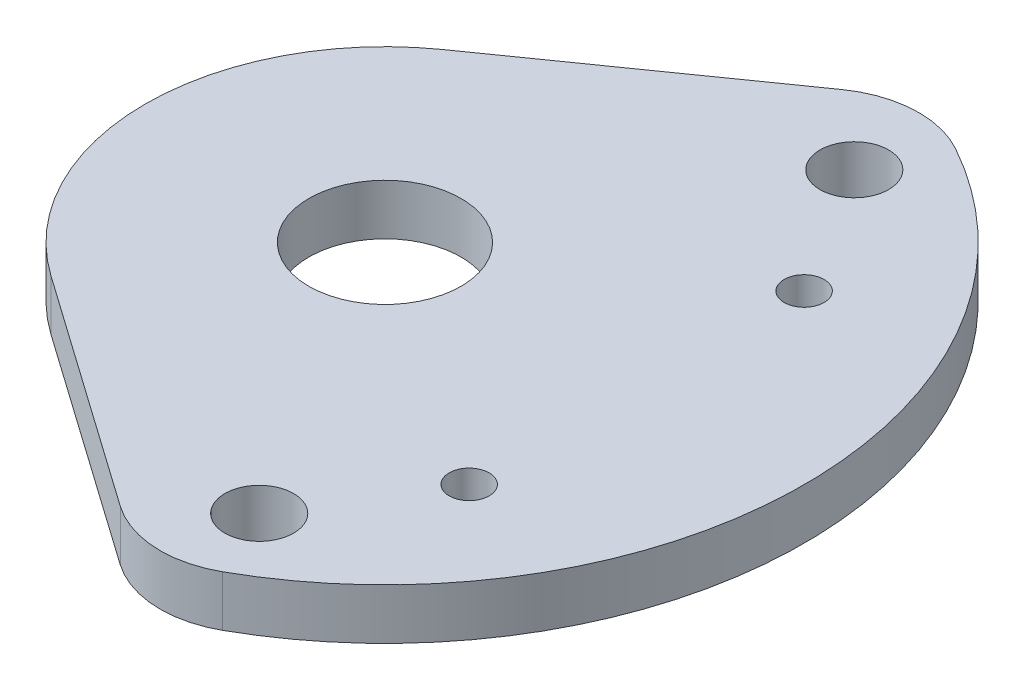
ISO-10303-21;
HEADER;
FILE_DESCRIPTION(('STEP AP214'),'2;1');
FILE_NAME('part.step','',(''),(''),'','','');
FILE_SCHEMA(('AUTOMOTIVE_DESIGN { 1 0 10303 214 1 1 1 1 }'));
ENDSEC;
DATA;
#1=APPLICATION_CONTEXT('core data for automotive mechanical design processes');
#2=APPLICATION_PROTOCOL_DEFINITION('international standard','automotive_design',2000,#1);
#3=PRODUCT_CONTEXT('',#1,'mechanical');
#4=PRODUCT('Part','Part','',(#3));
#5=PRODUCT_RELATED_PRODUCT_CATEGORY('part','',(#4));
#6=PRODUCT_DEFINITION_FORMATION('','',#4);
#7=PRODUCT_DEFINITION_CONTEXT('part definition',#1,'design');
#8=PRODUCT_DEFINITION('design','',#6,#7);
#9=PRODUCT_DEFINITION_SHAPE('','',#8);
#10=(LENGTH_UNIT() NAMED_UNIT(*) SI_UNIT(.MILLI.,.METRE.));
#11=(NAMED_UNIT(*) PLANE_ANGLE_UNIT() SI_UNIT($,.RADIAN.));
#12=(NAMED_UNIT(*) SI_UNIT($,.STERADIAN.) SOLID_ANGLE_UNIT());
#13=UNCERTAINTY_MEASURE_WITH_UNIT(LENGTH_MEASURE(1.E-05),#10,'distance_accuracy_value','');
#14=(GEOMETRIC_REPRESENTATION_CONTEXT(3) GLOBAL_UNCERTAINTY_ASSIGNED_CONTEXT((#13)) GLOBAL_UNIT_ASSIGNED_CONTEXT((#10,
#11,#12)) REPRESENTATION_CONTEXT('',''));
#15=CARTESIAN_POINT('',(0.,0.,0.));
#16=DIRECTION('',(0.,0.,1.));
#17=DIRECTION('',(1.,0.,0.));
#18=AXIS2_PLACEMENT_3D('',#15,#16,#17);
#19=CARTESIAN_POINT('',(-8.63580547562455,1.5875,-12.2646999061197));
#20=DIRECTION('',(0.575720365041637,0.,0.817646660407981));
#21=DIRECTION('',(0.817646660407981,0.,-0.575720365041637));
#22=AXIS2_PLACEMENT_3D('',#19,#20,#21);
#23=PLANE('',#22);
#24=DIRECTION('',(-0.817646660407981,0.,0.575720365041637));
#25=VECTOR('',#24,1.);
#26=CARTESIAN_POINT('',(-8.63580547562455,1.5875,-12.2646999061197));
#27=LINE('',#26,#25);
#28=CARTESIAN_POINT('',(6.01781653588474,1.5875,-22.5825902885482));
#29=VERTEX_POINT('',#28);
#30=CARTESIAN_POINT('',(-8.63580547562455,1.5875,-12.2646999061197));
#31=VERTEX_POINT('',#30);
#32=EDGE_CURVE('E93',#29,#31,#27,.T.);
#33=ORIENTED_EDGE('',*,*,#32,.F.);
#34=DIRECTION('',(0.,-1.,0.));
#35=VECTOR('',#34,1.);
#36=CARTESIAN_POINT('',(6.01781653588474,1.5875,-22.5825902885482));
#37=LINE('',#36,#35);
#38=CARTESIAN_POINT('',(6.01781653588474,-1.5875,-22.5825902885482));
#39=VERTEX_POINT('',#38);
#40=EDGE_CURVE('E118',#29,#39,#37,.T.);
#41=ORIENTED_EDGE('',*,*,#40,.T.);
#42=DIRECTION('',(-0.817646660407981,0.,0.575720365041637));
#43=VECTOR('',#42,1.);
#44=CARTESIAN_POINT('',(-8.63580547562455,-1.5875,-12.2646999061197));
#45=LINE('',#44,#43);
#46=CARTESIAN_POINT('',(-8.63580547562455,-1.5875,-12.2646999061197));
#47=VERTEX_POINT('',#46);
#48=EDGE_CURVE('E116',#39,#47,#45,.T.);
#49=ORIENTED_EDGE('',*,*,#48,.T.);
#50=DIRECTION('',(0.,-1.,0.));
#51=VECTOR('',#50,1.);
#52=CARTESIAN_POINT('',(-8.63580547562455,1.5875,-12.2646999061197));
#53=LINE('',#52,#51);
#54=EDGE_CURVE('E110',#31,#47,#53,.T.);
#55=ORIENTED_EDGE('',*,*,#54,.F.);
#56=EDGE_LOOP('',(#33,#41,#49,#55));
#57=FACE_BOUND('',#56,.T.);
#58=ADVANCED_FACE('F39',(#57),#23,.F.);
#59=CARTESIAN_POINT('',(0.,1.5875,0.));
#60=DIRECTION('',(0.,-1.,0.));
#61=DIRECTION('',(0.,0.,-1.));
#62=AXIS2_PLACEMENT_3D('',#59,#60,#61);
#63=CYLINDRICAL_SURFACE('',#62,15.);
#64=CARTESIAN_POINT('',(0.,-1.5875,0.));
#65=DIRECTION('',(0.,1.,0.));
#66=DIRECTION('',(0.,0.,1.));
#67=AXIS2_PLACEMENT_3D('',#64,#65,#66);
#68=CIRCLE('',#67,15.);
#69=CARTESIAN_POINT('',(-8.63580547562454,-1.5875,12.2646999061197));
#70=VERTEX_POINT('',#69);
#71=EDGE_CURVE('E147',#47,#70,#68,.T.);
#72=ORIENTED_EDGE('',*,*,#71,.T.);
#73=DIRECTION('',(0.,-1.,0.));
#74=VECTOR('',#73,1.);
#75=CARTESIAN_POINT('',(-8.63580547562454,1.5875,12.2646999061197));
#76=LINE('',#75,#74);
#77=CARTESIAN_POINT('',(-8.63580547562454,1.5875,12.2646999061197));
#78=VERTEX_POINT('',#77);
#79=EDGE_CURVE('E112',#78,#70,#76,.T.);
#80=ORIENTED_EDGE('',*,*,#79,.F.);
#81=CARTESIAN_POINT('',(0.,1.5875,0.));
#82=DIRECTION('',(0.,1.,0.));
#83=DIRECTION('',(0.,0.,1.));
#84=AXIS2_PLACEMENT_3D('',#81,#82,#83);
#85=CIRCLE('',#84,15.);
#86=EDGE_CURVE('E97',#31,#78,#85,.T.);
#87=ORIENTED_EDGE('',*,*,#86,.F.);
#88=ORIENTED_EDGE('',*,*,#54,.T.);
#89=EDGE_LOOP('',(#72,#80,#87,#88));
#90=FACE_BOUND('',#89,.T.);
#91=ADVANCED_FACE('F109',(#90),#63,.T.);
#92=CARTESIAN_POINT('',(-8.63580547562455,1.5875,12.2646999061197));
#93=DIRECTION('',(-0.575720365041636,0.,0.817646660407982));
#94=DIRECTION('',(0.817646660407982,0.,0.575720365041636));
#95=AXIS2_PLACEMENT_3D('',#92,#93,#94);
#96=PLANE('',#95);
#97=DIRECTION('',(-0.817646660407982,0.,-0.575720365041636));
#98=VECTOR('',#97,1.);
#99=CARTESIAN_POINT('',(-8.63580547562455,-1.5875,12.2646999061197));
#100=LINE('',#99,#98);
#101=CARTESIAN_POINT('',(6.01781653588475,-1.5875,22.5825902885482));
#102=VERTEX_POINT('',#101);
#103=EDGE_CURVE('E144',#102,#70,#100,.T.);
#104=ORIENTED_EDGE('',*,*,#103,.F.);
#105=DIRECTION('',(0.,1.,0.));
#106=VECTOR('',#105,1.);
#107=CARTESIAN_POINT('',(6.01781653588475,1.5875,22.5825902885482));
#108=LINE('',#107,#106);
#109=CARTESIAN_POINT('',(6.01781653588475,1.5875,22.5825902885482));
#110=VERTEX_POINT('',#109);
#111=EDGE_CURVE('E11',#102,#110,#108,.T.);
#112=ORIENTED_EDGE('',*,*,#111,.T.);
#113=DIRECTION('',(-0.817646660407982,0.,-0.575720365041636));
#114=VECTOR('',#113,1.);
#115=CARTESIAN_POINT('',(-8.63580547562455,1.5875,12.2646999061197));
#116=LINE('',#115,#114);
#117=EDGE_CURVE('E113',#110,#78,#116,.T.);
#118=ORIENTED_EDGE('',*,*,#117,.T.);
#119=ORIENTED_EDGE('',*,*,#79,.T.);
#120=EDGE_LOOP('',(#104,#112,#118,#119));
#121=FACE_BOUND('',#120,.T.);
#122=ADVANCED_FACE('F146',(#121),#96,.T.);
#123=CARTESIAN_POINT('',(0.,1.5875,0.));
#124=DIRECTION('',(0.,-1.,0.));
#125=DIRECTION('',(0.,0.,-1.));
#126=AXIS2_PLACEMENT_3D('',#123,#124,#125);
#127=CYLINDRICAL_SURFACE('',#126,26.25);
#128=CARTESIAN_POINT('',(0.,-1.5875,0.));
#129=DIRECTION('',(0.,1.,0.));
#130=DIRECTION('',(0.,0.,1.));
#131=AXIS2_PLACEMENT_3D('',#128,#129,#130);
#132=CIRCLE('',#131,26.25);
#133=CARTESIAN_POINT('',(12.7604559002438,-1.5875,22.9397747420922));
#134=VERTEX_POINT('',#133);
#135=CARTESIAN_POINT('',(12.7604559002438,-1.5875,-22.9397747420922));
#136=VERTEX_POINT('',#135);
#137=EDGE_CURVE('E145',#134,#136,#132,.T.);
#138=ORIENTED_EDGE('',*,*,#137,.T.);
#139=DIRECTION('',(0.,-1.,0.));
#140=VECTOR('',#139,1.);
#141=CARTESIAN_POINT('',(12.7604559002438,1.5875,-22.9397747420922));
#142=LINE('',#141,#140);
#143=CARTESIAN_POINT('',(12.7604559002438,1.5875,-22.9397747420922));
#144=VERTEX_POINT('',#143);
#145=EDGE_CURVE('E60',#136,#144,#142,.F.);
#146=ORIENTED_EDGE('',*,*,#145,.T.);
#147=CARTESIAN_POINT('',(0.,1.5875,0.));
#148=DIRECTION('',(0.,1.,0.));
#149=DIRECTION('',(0.,0.,1.));
#150=AXIS2_PLACEMENT_3D('',#147,#148,#149);
#151=CIRCLE('',#150,26.25);
#152=CARTESIAN_POINT('',(12.7604559002438,1.5875,22.9397747420922));
#153=VERTEX_POINT('',#152);
#154=EDGE_CURVE('E135',#153,#144,#151,.T.);
#155=ORIENTED_EDGE('',*,*,#154,.F.);
#156=DIRECTION('',(0.,-1.,0.));
#157=VECTOR('',#156,1.);
#158=CARTESIAN_POINT('',(12.7604559002438,1.5875,22.9397747420922));
#159=LINE('',#158,#157);
#160=EDGE_CURVE('E129',#153,#134,#159,.T.);
#161=ORIENTED_EDGE('',*,*,#160,.T.);
#162=EDGE_LOOP('',(#138,#146,#155,#161));
#163=FACE_BOUND('',#162,.T.);
#164=ADVANCED_FACE('F138',(#163),#127,.T.);
#165=CARTESIAN_POINT('',(0.,1.5875,0.));
#166=DIRECTION('',(0.,-1.,0.));
#167=DIRECTION('',(0.,0.,-1.));
#168=AXIS2_PLACEMENT_3D('',#165,#166,#167);
#169=CYLINDRICAL_SURFACE('',#168,4.7625);
#170=CARTESIAN_POINT('',(0.,1.5875,0.));
#171=DIRECTION('',(0.,1.,0.));
#172=DIRECTION('',(0.,0.,1.));
#173=AXIS2_PLACEMENT_3D('',#170,#171,#172);
#174=CIRCLE('',#173,4.7625);
#175=CARTESIAN_POINT('',(0.,1.5875,4.7625));
#176=VERTEX_POINT('',#175);
#177=EDGE_CURVE('E122',#176,#176,#174,.T.);
#178=ORIENTED_EDGE('',*,*,#177,.T.);
#179=EDGE_LOOP('',(#178));
#180=FACE_BOUND('',#179,.T.);
#181=CARTESIAN_POINT('',(0.,-1.5875,0.));
#182=DIRECTION('',(0.,1.,0.));
#183=DIRECTION('',(0.,0.,1.));
#184=AXIS2_PLACEMENT_3D('',#181,#182,#183);
#185=CIRCLE('',#184,4.7625);
#186=CARTESIAN_POINT('',(0.,-1.5875,4.7625));
#187=VERTEX_POINT('',#186);
#188=EDGE_CURVE('E104',#187,#187,#185,.T.);
#189=ORIENTED_EDGE('',*,*,#188,.F.);
#190=EDGE_LOOP('',(#189));
#191=FACE_BOUND('',#190,.T.);
#192=ADVANCED_FACE('F155',(#180,#191),#169,.F.);
#193=CARTESIAN_POINT('',(0.,1.5875,0.));
#194=DIRECTION('',(0.,1.,0.));
#195=DIRECTION('',(0.,0.,1.));
#196=AXIS2_PLACEMENT_3D('',#193,#194,#195);
#197=PLANE('',#196);
#198=CARTESIAN_POINT('',(15.75,1.5875,10.4799999999999));
#199=DIRECTION('',(0.,1.,0.));
#200=DIRECTION('',(0.,0.,1.));
#201=AXIS2_PLACEMENT_3D('',#198,#199,#200);
#202=CIRCLE('',#201,1.24999999999999);
#203=CARTESIAN_POINT('',(15.75,1.5875,11.7299999999999));
#204=VERTEX_POINT('',#203);
#205=EDGE_CURVE('E215',#204,#204,#202,.T.);
#206=ORIENTED_EDGE('',*,*,#205,.F.);
#207=EDGE_LOOP('',(#206));
#208=FACE_BOUND('',#207,.T.);
#209=CARTESIAN_POINT('',(15.75,1.5875,-10.4800000000001));
#210=DIRECTION('',(0.,1.,0.));
#211=DIRECTION('',(0.,0.,1.));
#212=AXIS2_PLACEMENT_3D('',#209,#210,#211);
#213=CIRCLE('',#212,1.24999999999999);
#214=CARTESIAN_POINT('',(15.75,1.5875,-9.23000000000007));
#215=VERTEX_POINT('',#214);
#216=EDGE_CURVE('E209',#215,#215,#213,.T.);
#217=ORIENTED_EDGE('',*,*,#216,.F.);
#218=EDGE_LOOP('',(#217));
#219=FACE_BOUND('',#218,.T.);
#220=CARTESIAN_POINT('',(10.7500000000001,1.5875,-18.6195461813654));
#221=DIRECTION('',(0.,1.,0.));
#222=DIRECTION('',(0.,0.,1.));
#223=AXIS2_PLACEMENT_3D('',#220,#221,#222);
#224=CIRCLE('',#223,2.15);
#225=CARTESIAN_POINT('',(10.7500000000001,1.5875,-16.4695461813654));
#226=VERTEX_POINT('',#225);
#227=EDGE_CURVE('E203',#226,#226,#224,.T.);
#228=ORIENTED_EDGE('',*,*,#227,.F.);
#229=EDGE_LOOP('',(#228));
#230=FACE_BOUND('',#229,.T.);
#231=CARTESIAN_POINT('',(10.7499999999998,1.5875,18.6195461813655));
#232=DIRECTION('',(0.,1.,0.));
#233=DIRECTION('',(0.,0.,1.));
#234=AXIS2_PLACEMENT_3D('',#231,#232,#233);
#235=CIRCLE('',#234,2.15);
#236=CARTESIAN_POINT('',(10.7499999999998,1.5875,20.7695461813655));
#237=VERTEX_POINT('',#236);
#238=EDGE_CURVE('E193',#237,#237,#235,.T.);
#239=ORIENTED_EDGE('',*,*,#238,.F.);
#240=EDGE_LOOP('',(#239));
#241=FACE_BOUND('',#240,.T.);
#242=ORIENTED_EDGE('',*,*,#154,.T.);
#243=CARTESIAN_POINT('',(9.67364085389913,1.5875,-17.3905339949575));
#244=DIRECTION('',(0.,1.,0.));
#245=DIRECTION('',(0.,0.,1.));
#246=AXIS2_PLACEMENT_3D('',#243,#244,#245);
#247=CIRCLE('',#246,6.35);
#248=EDGE_CURVE('E47',#144,#29,#247,.T.);
#249=ORIENTED_EDGE('',*,*,#248,.T.);
#250=ORIENTED_EDGE('',*,*,#32,.T.);
#251=ORIENTED_EDGE('',*,*,#86,.T.);
#252=ORIENTED_EDGE('',*,*,#117,.F.);
#253=CARTESIAN_POINT('',(9.67364085389914,1.5875,17.3905339949575));
#254=DIRECTION('',(0.,1.,0.));
#255=DIRECTION('',(0.,0.,1.));
#256=AXIS2_PLACEMENT_3D('',#253,#254,#255);
#257=CIRCLE('',#256,6.35);
#258=EDGE_CURVE('E133',#110,#153,#257,.T.);
#259=ORIENTED_EDGE('',*,*,#258,.T.);
#260=EDGE_LOOP('',(#242,#249,#250,#251,#252,#259));
#261=FACE_BOUND('',#260,.T.);
#262=ORIENTED_EDGE('',*,*,#177,.F.);
#263=EDGE_LOOP('',(#262));
#264=FACE_BOUND('',#263,.T.);
#265=ADVANCED_FACE('F95',(#208,#219,#230,#241,#261,#264),#197,.T.);
#266=CARTESIAN_POINT('',(0.,-1.5875,0.));
#267=DIRECTION('',(0.,1.,0.));
#268=DIRECTION('',(0.,0.,1.));
#269=AXIS2_PLACEMENT_3D('',#266,#267,#268);
#270=PLANE('',#269);
#271=CARTESIAN_POINT('',(15.75,-1.5875,10.4799999999999));
#272=DIRECTION('',(0.,1.,0.));
#273=DIRECTION('',(0.,0.,1.));
#274=AXIS2_PLACEMENT_3D('',#271,#272,#273);
#275=CIRCLE('',#274,1.24999999999999);
#276=CARTESIAN_POINT('',(15.75,-1.5875,11.7299999999999));
#277=VERTEX_POINT('',#276);
#278=EDGE_CURVE('E212',#277,#277,#275,.T.);
#279=ORIENTED_EDGE('',*,*,#278,.T.);
#280=EDGE_LOOP('',(#279));
#281=FACE_BOUND('',#280,.T.);
#282=CARTESIAN_POINT('',(15.75,-1.5875,-10.4800000000001));
#283=DIRECTION('',(0.,1.,0.));
#284=DIRECTION('',(0.,0.,1.));
#285=AXIS2_PLACEMENT_3D('',#282,#283,#284);
#286=CIRCLE('',#285,1.24999999999999);
#287=CARTESIAN_POINT('',(15.75,-1.5875,-9.23000000000007));
#288=VERTEX_POINT('',#287);
#289=EDGE_CURVE('E206',#288,#288,#286,.T.);
#290=ORIENTED_EDGE('',*,*,#289,.T.);
#291=EDGE_LOOP('',(#290));
#292=FACE_BOUND('',#291,.T.);
#293=CARTESIAN_POINT('',(10.7500000000001,-1.5875,-18.6195461813654));
#294=DIRECTION('',(0.,1.,0.));
#295=DIRECTION('',(0.,0.,1.));
#296=AXIS2_PLACEMENT_3D('',#293,#294,#295);
#297=CIRCLE('',#296,2.15);
#298=CARTESIAN_POINT('',(10.7500000000001,-1.5875,-16.4695461813654));
#299=VERTEX_POINT('',#298);
#300=EDGE_CURVE('E200',#299,#299,#297,.T.);
#301=ORIENTED_EDGE('',*,*,#300,.T.);
#302=EDGE_LOOP('',(#301));
#303=FACE_BOUND('',#302,.T.);
#304=CARTESIAN_POINT('',(10.7499999999998,-1.5875,18.6195461813655));
#305=DIRECTION('',(0.,1.,0.));
#306=DIRECTION('',(0.,0.,1.));
#307=AXIS2_PLACEMENT_3D('',#304,#305,#306);
#308=CIRCLE('',#307,2.15);
#309=CARTESIAN_POINT('',(10.7499999999998,-1.5875,20.7695461813655));
#310=VERTEX_POINT('',#309);
#311=EDGE_CURVE('E191',#310,#310,#308,.T.);
#312=ORIENTED_EDGE('',*,*,#311,.T.);
#313=EDGE_LOOP('',(#312));
#314=FACE_BOUND('',#313,.T.);
#315=ORIENTED_EDGE('',*,*,#48,.F.);
#316=CARTESIAN_POINT('',(9.67364085389913,-1.5875,-17.3905339949575));
#317=DIRECTION('',(0.,1.,0.));
#318=DIRECTION('',(0.,0.,1.));
#319=AXIS2_PLACEMENT_3D('',#316,#317,#318);
#320=CIRCLE('',#319,6.35);
#321=EDGE_CURVE('E127',#39,#136,#320,.F.);
#322=ORIENTED_EDGE('',*,*,#321,.T.);
#323=ORIENTED_EDGE('',*,*,#137,.F.);
#324=CARTESIAN_POINT('',(9.67364085389914,-1.5875,17.3905339949575));
#325=DIRECTION('',(0.,1.,0.));
#326=DIRECTION('',(0.,0.,1.));
#327=AXIS2_PLACEMENT_3D('',#324,#325,#326);
#328=CIRCLE('',#327,6.35);
#329=EDGE_CURVE('E120',#134,#102,#328,.F.);
#330=ORIENTED_EDGE('',*,*,#329,.T.);
#331=ORIENTED_EDGE('',*,*,#103,.T.);
#332=ORIENTED_EDGE('',*,*,#71,.F.);
#333=EDGE_LOOP('',(#315,#322,#323,#330,#331,#332));
#334=FACE_BOUND('',#333,.T.);
#335=ORIENTED_EDGE('',*,*,#188,.T.);
#336=EDGE_LOOP('',(#335));
#337=FACE_BOUND('',#336,.T.);
#338=ADVANCED_FACE('F142',(#281,#292,#303,#314,#334,#337),#270,.F.);
#339=CARTESIAN_POINT('',(10.7499999999998,1.5875,18.6195461813655));
#340=DIRECTION('',(0.,1.,0.));
#341=DIRECTION('',(0.,0.,1.));
#342=AXIS2_PLACEMENT_3D('',#339,#340,#341);
#343=CYLINDRICAL_SURFACE('',#342,2.15);
#344=ORIENTED_EDGE('',*,*,#311,.F.);
#345=EDGE_LOOP('',(#344));
#346=FACE_BOUND('',#345,.T.);
#347=ORIENTED_EDGE('',*,*,#238,.T.);
#348=EDGE_LOOP('',(#347));
#349=FACE_BOUND('',#348,.T.);
#350=ADVANCED_FACE('F226',(#346,#349),#343,.F.);
#351=CARTESIAN_POINT('',(10.7500000000001,1.5875,-18.6195461813654));
#352=DIRECTION('',(0.,1.,0.));
#353=DIRECTION('',(0.,0.,1.));
#354=AXIS2_PLACEMENT_3D('',#351,#352,#353);
#355=CYLINDRICAL_SURFACE('',#354,2.15);
#356=ORIENTED_EDGE('',*,*,#300,.F.);
#357=EDGE_LOOP('',(#356));
#358=FACE_BOUND('',#357,.T.);
#359=ORIENTED_EDGE('',*,*,#227,.T.);
#360=EDGE_LOOP('',(#359));
#361=FACE_BOUND('',#360,.T.);
#362=ADVANCED_FACE('F228',(#358,#361),#355,.F.);
#363=CARTESIAN_POINT('',(15.75,1.5875,-10.4800000000001));
#364=DIRECTION('',(0.,1.,0.));
#365=DIRECTION('',(0.,0.,1.));
#366=AXIS2_PLACEMENT_3D('',#363,#364,#365);
#367=CYLINDRICAL_SURFACE('',#366,1.24999999999999);
#368=ORIENTED_EDGE('',*,*,#289,.F.);
#369=EDGE_LOOP('',(#368));
#370=FACE_BOUND('',#369,.T.);
#371=ORIENTED_EDGE('',*,*,#216,.T.);
#372=EDGE_LOOP('',(#371));
#373=FACE_BOUND('',#372,.T.);
#374=ADVANCED_FACE('F188',(#370,#373),#367,.F.);
#375=CARTESIAN_POINT('',(15.75,1.5875,10.4799999999999));
#376=DIRECTION('',(0.,1.,0.));
#377=DIRECTION('',(0.,0.,1.));
#378=AXIS2_PLACEMENT_3D('',#375,#376,#377);
#379=CYLINDRICAL_SURFACE('',#378,1.24999999999999);
#380=ORIENTED_EDGE('',*,*,#278,.F.);
#381=EDGE_LOOP('',(#380));
#382=FACE_BOUND('',#381,.T.);
#383=ORIENTED_EDGE('',*,*,#205,.T.);
#384=EDGE_LOOP('',(#383));
#385=FACE_BOUND('',#384,.T.);
#386=ADVANCED_FACE('F181',(#382,#385),#379,.F.);
#387=CARTESIAN_POINT('',(9.67364085389913,1.5875,-17.3905339949575));
#388=DIRECTION('',(0.,-1.,0.));
#389=DIRECTION('',(0.,0.,-1.));
#390=AXIS2_PLACEMENT_3D('',#387,#388,#389);
#391=CYLINDRICAL_SURFACE('',#390,6.35);
#392=ORIENTED_EDGE('',*,*,#248,.F.);
#393=ORIENTED_EDGE('',*,*,#145,.F.);
#394=ORIENTED_EDGE('',*,*,#321,.F.);
#395=ORIENTED_EDGE('',*,*,#40,.F.);
#396=EDGE_LOOP('',(#392,#393,#394,#395));
#397=FACE_BOUND('',#396,.T.);
#398=ADVANCED_FACE('F179',(#397),#391,.T.);
#399=CARTESIAN_POINT('',(9.67364085389914,1.5875,17.3905339949575));
#400=DIRECTION('',(0.,-1.,0.));
#401=DIRECTION('',(0.,0.,-1.));
#402=AXIS2_PLACEMENT_3D('',#399,#400,#401);
#403=CYLINDRICAL_SURFACE('',#402,6.35);
#404=ORIENTED_EDGE('',*,*,#258,.F.);
#405=ORIENTED_EDGE('',*,*,#111,.F.);
#406=ORIENTED_EDGE('',*,*,#329,.F.);
#407=ORIENTED_EDGE('',*,*,#160,.F.);
#408=EDGE_LOOP('',(#404,#405,#406,#407));
#409=FACE_BOUND('',#408,.T.);
#410=ADVANCED_FACE('F41',(#409),#403,.T.);
#411=CLOSED_SHELL('',(#58,#91,#122,#164,#192,#265,#338,#350,#362,#374,#386,#398,#410));
#412=MANIFOLD_SOLID_BREP('B2',#411);
#413=ADVANCED_BREP_SHAPE_REPRESENTATION('',(#18,#412),#14);
#414=SHAPE_DEFINITION_REPRESENTATION(#9,#413);
ENDSEC;
END-ISO-10303-21;
